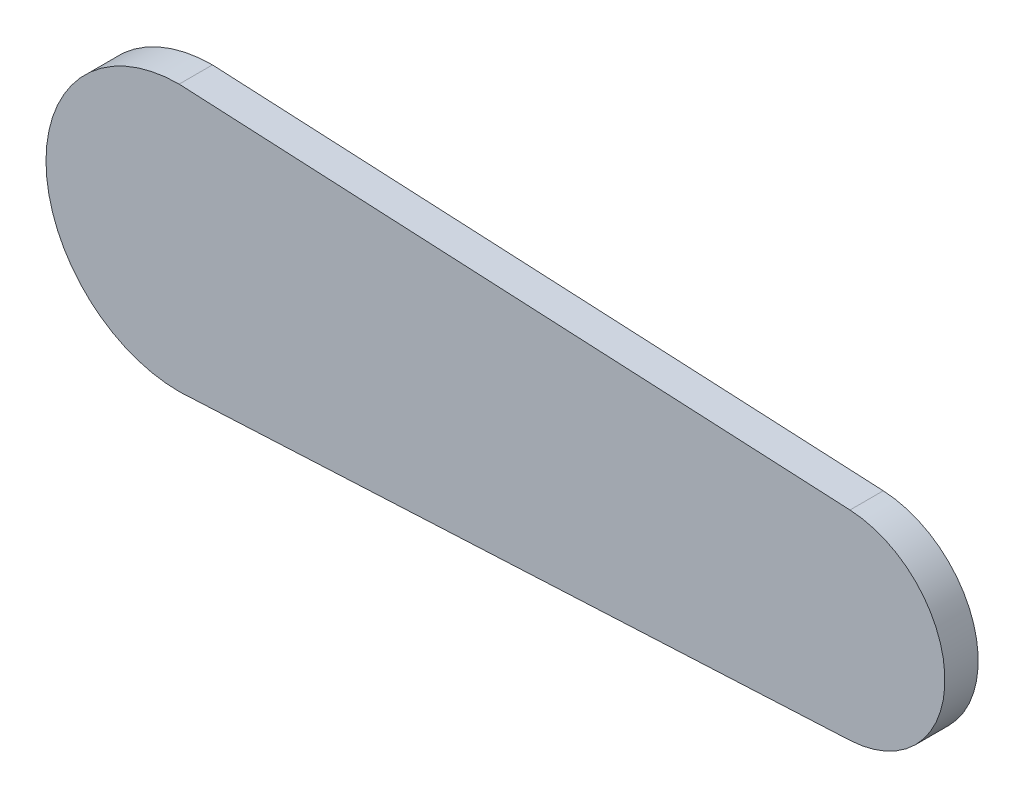
ISO-10303-21;
HEADER;
FILE_DESCRIPTION(('STEP AP214'),'2;1');
FILE_NAME('part.step','',(''),(''),'','','');
FILE_SCHEMA(('AUTOMOTIVE_DESIGN { 1 0 10303 214 1 1 1 1 }'));
ENDSEC;
DATA;
#1=APPLICATION_CONTEXT('core data for automotive mechanical design processes');
#2=APPLICATION_PROTOCOL_DEFINITION('international standard','automotive_design',2000,#1);
#3=PRODUCT_CONTEXT('',#1,'mechanical');
#4=PRODUCT('Part','Part','',(#3));
#5=PRODUCT_RELATED_PRODUCT_CATEGORY('part','',(#4));
#6=PRODUCT_DEFINITION_FORMATION('','',#4);
#7=PRODUCT_DEFINITION_CONTEXT('part definition',#1,'design');
#8=PRODUCT_DEFINITION('design','',#6,#7);
#9=PRODUCT_DEFINITION_SHAPE('','',#8);
#10=(LENGTH_UNIT() NAMED_UNIT(*) SI_UNIT(.MILLI.,.METRE.));
#11=(NAMED_UNIT(*) PLANE_ANGLE_UNIT() SI_UNIT($,.RADIAN.));
#12=(NAMED_UNIT(*) SI_UNIT($,.STERADIAN.) SOLID_ANGLE_UNIT());
#13=UNCERTAINTY_MEASURE_WITH_UNIT(LENGTH_MEASURE(1.E-05),#10,'distance_accuracy_value','');
#14=(GEOMETRIC_REPRESENTATION_CONTEXT(3) GLOBAL_UNCERTAINTY_ASSIGNED_CONTEXT((#13)) GLOBAL_UNIT_ASSIGNED_CONTEXT((#10,
#11,#12)) REPRESENTATION_CONTEXT('',''));
#15=CARTESIAN_POINT('',(0.,0.,0.));
#16=DIRECTION('',(0.,0.,1.));
#17=DIRECTION('',(1.,0.,0.));
#18=AXIS2_PLACEMENT_3D('',#15,#16,#17);
#19=CARTESIAN_POINT('',(1.98762813560686,-39.9009882768305,10.));
#20=DIRECTION('',(-0.0497523173253079,0.998761586626539,0.));
#21=DIRECTION('',(-0.998761586626539,-0.0497523173253079,0.));
#22=AXIS2_PLACEMENT_3D('',#19,#20,#21);
#23=PLANE('',#22);
#24=DIRECTION('',(0.998761586626539,0.0497523173253079,0.));
#25=VECTOR('',#24,1.);
#26=CARTESIAN_POINT('',(1.98762813560686,-39.9009882768305,0.));
#27=LINE('',#26,#25);
#28=CARTESIAN_POINT('',(0.,-40.,0.));
#29=VERTEX_POINT('',#28);
#30=CARTESIAN_POINT('',(201.492569519759,-29.9628475987962,0.));
#31=VERTEX_POINT('',#30);
#32=EDGE_CURVE('E104',#29,#31,#27,.T.);
#33=ORIENTED_EDGE('',*,*,#32,.T.);
#34=DIRECTION('',(0.,0.,-1.));
#35=VECTOR('',#34,1.);
#36=CARTESIAN_POINT('',(201.492569519759,-29.9628475987962,10.));
#37=LINE('',#36,#35);
#38=CARTESIAN_POINT('',(201.492569519759,-29.9628475987962,10.));
#39=VERTEX_POINT('',#38);
#40=EDGE_CURVE('E11',#39,#31,#37,.T.);
#41=ORIENTED_EDGE('',*,*,#40,.F.);
#42=DIRECTION('',(0.998761586626539,0.0497523173253079,0.));
#43=VECTOR('',#42,1.);
#44=CARTESIAN_POINT('',(1.98762813560686,-39.9009882768305,10.));
#45=LINE('',#44,#43);
#46=CARTESIAN_POINT('',(0.,-40.,10.));
#47=VERTEX_POINT('',#46);
#48=EDGE_CURVE('E89',#47,#39,#45,.T.);
#49=ORIENTED_EDGE('',*,*,#48,.F.);
#50=DIRECTION('',(0.,0.,-1.));
#51=VECTOR('',#50,1.);
#52=CARTESIAN_POINT('',(0.,-40.,10.));
#53=LINE('',#52,#51);
#54=EDGE_CURVE('E100',#47,#29,#53,.T.);
#55=ORIENTED_EDGE('',*,*,#54,.T.);
#56=EDGE_LOOP('',(#33,#41,#49,#55));
#57=FACE_BOUND('',#56,.T.);
#58=ADVANCED_FACE('F42',(#57),#23,.F.);
#59=CARTESIAN_POINT('',(200.,0.,10.));
#60=DIRECTION('',(0.,0.,-1.));
#61=DIRECTION('',(-1.,0.,0.));
#62=AXIS2_PLACEMENT_3D('',#59,#60,#61);
#63=CYLINDRICAL_SURFACE('',#62,30.);
#64=CARTESIAN_POINT('',(200.,0.,0.));
#65=DIRECTION('',(0.,0.,1.));
#66=DIRECTION('',(1.,0.,0.));
#67=AXIS2_PLACEMENT_3D('',#64,#65,#66);
#68=CIRCLE('',#67,30.);
#69=CARTESIAN_POINT('',(201.492569519759,29.9628475987962,0.));
#70=VERTEX_POINT('',#69);
#71=EDGE_CURVE('E94',#31,#70,#68,.T.);
#72=ORIENTED_EDGE('',*,*,#71,.T.);
#73=DIRECTION('',(0.,0.,-1.));
#74=VECTOR('',#73,1.);
#75=CARTESIAN_POINT('',(201.492569519759,29.9628475987962,10.));
#76=LINE('',#75,#74);
#77=CARTESIAN_POINT('',(201.492569519759,29.9628475987962,10.));
#78=VERTEX_POINT('',#77);
#79=EDGE_CURVE('E50',#78,#70,#76,.T.);
#80=ORIENTED_EDGE('',*,*,#79,.F.);
#81=CARTESIAN_POINT('',(200.,0.,10.));
#82=DIRECTION('',(0.,0.,1.));
#83=DIRECTION('',(1.,0.,0.));
#84=AXIS2_PLACEMENT_3D('',#81,#82,#83);
#85=CIRCLE('',#84,30.);
#86=EDGE_CURVE('E84',#39,#78,#85,.T.);
#87=ORIENTED_EDGE('',*,*,#86,.F.);
#88=ORIENTED_EDGE('',*,*,#40,.T.);
#89=EDGE_LOOP('',(#72,#80,#87,#88));
#90=FACE_BOUND('',#89,.T.);
#91=ADVANCED_FACE('F93',(#90),#63,.T.);
#92=CARTESIAN_POINT('',(1.98762813560686,39.9009882768305,10.));
#93=DIRECTION('',(0.0497523173253079,0.998761586626539,0.));
#94=DIRECTION('',(-0.998761586626539,0.0497523173253079,0.));
#95=AXIS2_PLACEMENT_3D('',#92,#93,#94);
#96=PLANE('',#95);
#97=DIRECTION('',(0.998761586626539,-0.0497523173253079,0.));
#98=VECTOR('',#97,1.);
#99=CARTESIAN_POINT('',(1.98762813560686,39.9009882768305,0.));
#100=LINE('',#99,#98);
#101=CARTESIAN_POINT('',(0.,40.,0.));
#102=VERTEX_POINT('',#101);
#103=EDGE_CURVE('E108',#102,#70,#100,.T.);
#104=ORIENTED_EDGE('',*,*,#103,.F.);
#105=DIRECTION('',(0.,0.,-1.));
#106=VECTOR('',#105,1.);
#107=CARTESIAN_POINT('',(0.,40.,10.));
#108=LINE('',#107,#106);
#109=CARTESIAN_POINT('',(0.,40.,10.));
#110=VERTEX_POINT('',#109);
#111=EDGE_CURVE('E74',#110,#102,#108,.T.);
#112=ORIENTED_EDGE('',*,*,#111,.F.);
#113=DIRECTION('',(0.998761586626539,-0.0497523173253079,0.));
#114=VECTOR('',#113,1.);
#115=CARTESIAN_POINT('',(1.98762813560686,39.9009882768305,10.));
#116=LINE('',#115,#114);
#117=EDGE_CURVE('E87',#110,#78,#116,.T.);
#118=ORIENTED_EDGE('',*,*,#117,.T.);
#119=ORIENTED_EDGE('',*,*,#79,.T.);
#120=EDGE_LOOP('',(#104,#112,#118,#119));
#121=FACE_BOUND('',#120,.T.);
#122=ADVANCED_FACE('F98',(#121),#96,.T.);
#123=CARTESIAN_POINT('',(0.,0.,10.));
#124=DIRECTION('',(0.,0.,-1.));
#125=DIRECTION('',(-1.,0.,0.));
#126=AXIS2_PLACEMENT_3D('',#123,#124,#125);
#127=CYLINDRICAL_SURFACE('',#126,40.);
#128=CARTESIAN_POINT('',(0.,0.,0.));
#129=DIRECTION('',(0.,0.,1.));
#130=DIRECTION('',(1.,0.,0.));
#131=AXIS2_PLACEMENT_3D('',#128,#129,#130);
#132=CIRCLE('',#131,40.);
#133=EDGE_CURVE('E77',#102,#29,#132,.T.);
#134=ORIENTED_EDGE('',*,*,#133,.T.);
#135=ORIENTED_EDGE('',*,*,#54,.F.);
#136=CARTESIAN_POINT('',(0.,0.,10.));
#137=DIRECTION('',(0.,0.,1.));
#138=DIRECTION('',(1.,0.,0.));
#139=AXIS2_PLACEMENT_3D('',#136,#137,#138);
#140=CIRCLE('',#139,40.);
#141=EDGE_CURVE('E58',#110,#47,#140,.T.);
#142=ORIENTED_EDGE('',*,*,#141,.F.);
#143=ORIENTED_EDGE('',*,*,#111,.T.);
#144=EDGE_LOOP('',(#134,#135,#142,#143));
#145=FACE_BOUND('',#144,.T.);
#146=ADVANCED_FACE('F121',(#145),#127,.T.);
#147=CARTESIAN_POINT('',(0.,0.,10.));
#148=DIRECTION('',(0.,0.,1.));
#149=DIRECTION('',(1.,0.,0.));
#150=AXIS2_PLACEMENT_3D('',#147,#148,#149);
#151=PLANE('',#150);
#152=ORIENTED_EDGE('',*,*,#48,.T.);
#153=ORIENTED_EDGE('',*,*,#86,.T.);
#154=ORIENTED_EDGE('',*,*,#117,.F.);
#155=ORIENTED_EDGE('',*,*,#141,.T.);
#156=EDGE_LOOP('',(#152,#153,#154,#155));
#157=FACE_BOUND('',#156,.T.);
#158=ADVANCED_FACE('F85',(#157),#151,.T.);
#159=CARTESIAN_POINT('',(0.,0.,0.));
#160=DIRECTION('',(0.,0.,1.));
#161=DIRECTION('',(1.,0.,0.));
#162=AXIS2_PLACEMENT_3D('',#159,#160,#161);
#163=PLANE('',#162);
#164=ORIENTED_EDGE('',*,*,#32,.F.);
#165=ORIENTED_EDGE('',*,*,#133,.F.);
#166=ORIENTED_EDGE('',*,*,#103,.T.);
#167=ORIENTED_EDGE('',*,*,#71,.F.);
#168=EDGE_LOOP('',(#164,#165,#166,#167));
#169=FACE_BOUND('',#168,.T.);
#170=ADVANCED_FACE('F115',(#169),#163,.F.);
#171=CLOSED_SHELL('',(#58,#91,#122,#146,#158,#170));
#172=MANIFOLD_SOLID_BREP('B2',#171);
#173=ADVANCED_BREP_SHAPE_REPRESENTATION('',(#18,#172),#14);
#174=SHAPE_DEFINITION_REPRESENTATION(#9,#173);
ENDSEC;
END-ISO-10303-21;
